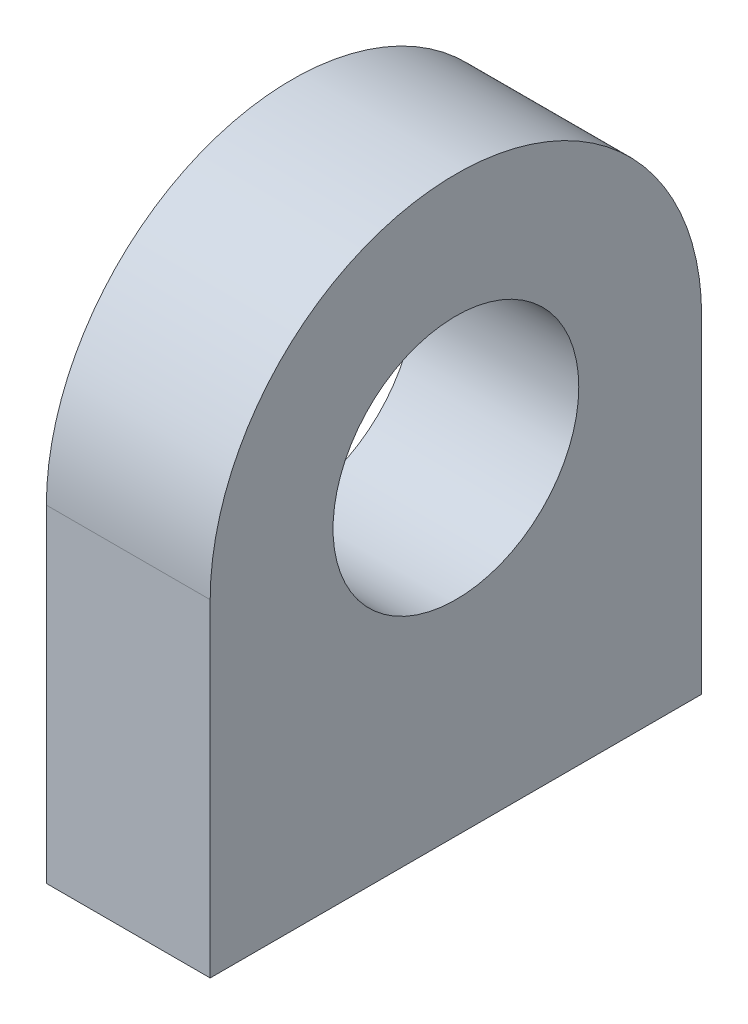
ISO-10303-21;
HEADER;
FILE_DESCRIPTION(('STEP AP214'),'2;1');
FILE_NAME('part.step','',(''),(''),'','','');
FILE_SCHEMA(('AUTOMOTIVE_DESIGN { 1 0 10303 214 1 1 1 1 }'));
ENDSEC;
DATA;
#1=APPLICATION_CONTEXT('core data for automotive mechanical design processes');
#2=APPLICATION_PROTOCOL_DEFINITION('international standard','automotive_design',2000,#1);
#3=PRODUCT_CONTEXT('',#1,'mechanical');
#4=PRODUCT('Part','Part','',(#3));
#5=PRODUCT_RELATED_PRODUCT_CATEGORY('part','',(#4));
#6=PRODUCT_DEFINITION_FORMATION('','',#4);
#7=PRODUCT_DEFINITION_CONTEXT('part definition',#1,'design');
#8=PRODUCT_DEFINITION('design','',#6,#7);
#9=PRODUCT_DEFINITION_SHAPE('','',#8);
#10=(LENGTH_UNIT() NAMED_UNIT(*) SI_UNIT(.MILLI.,.METRE.));
#11=(NAMED_UNIT(*) PLANE_ANGLE_UNIT() SI_UNIT($,.RADIAN.));
#12=(NAMED_UNIT(*) SI_UNIT($,.STERADIAN.) SOLID_ANGLE_UNIT());
#13=UNCERTAINTY_MEASURE_WITH_UNIT(LENGTH_MEASURE(1.E-05),#10,'distance_accuracy_value','');
#14=(GEOMETRIC_REPRESENTATION_CONTEXT(3) GLOBAL_UNCERTAINTY_ASSIGNED_CONTEXT((#13)) GLOBAL_UNIT_ASSIGNED_CONTEXT((#10,
#11,#12)) REPRESENTATION_CONTEXT('',''));
#15=CARTESIAN_POINT('',(0.,0.,0.));
#16=DIRECTION('',(0.,0.,1.));
#17=DIRECTION('',(1.,0.,0.));
#18=AXIS2_PLACEMENT_3D('',#15,#16,#17);
#19=CARTESIAN_POINT('',(10.,0.,0.));
#20=DIRECTION('',(1.,0.,0.));
#21=DIRECTION('',(0.,0.,-1.));
#22=AXIS2_PLACEMENT_3D('',#19,#20,#21);
#23=PLANE('',#22);
#24=CARTESIAN_POINT('',(10.,0.,0.));
#25=DIRECTION('',(1.,0.,0.));
#26=DIRECTION('',(0.,0.,-1.));
#27=AXIS2_PLACEMENT_3D('',#24,#25,#26);
#28=CIRCLE('',#27,15.);
#29=CARTESIAN_POINT('',(10.,0.,-15.));
#30=VERTEX_POINT('',#29);
#31=CARTESIAN_POINT('',(10.,0.,15.));
#32=VERTEX_POINT('',#31);
#33=EDGE_CURVE('E85',#30,#32,#28,.T.);
#34=ORIENTED_EDGE('',*,*,#33,.T.);
#35=DIRECTION('',(0.,-1.,0.));
#36=VECTOR('',#35,1.);
#37=CARTESIAN_POINT('',(10.,0.,15.));
#38=LINE('',#37,#36);
#39=CARTESIAN_POINT('',(10.,-20.,15.));
#40=VERTEX_POINT('',#39);
#41=EDGE_CURVE('E80',#32,#40,#38,.T.);
#42=ORIENTED_EDGE('',*,*,#41,.T.);
#43=DIRECTION('',(0.,0.,-1.));
#44=VECTOR('',#43,1.);
#45=CARTESIAN_POINT('',(10.,-20.,15.));
#46=LINE('',#45,#44);
#47=CARTESIAN_POINT('',(10.,-20.,-15.));
#48=VERTEX_POINT('',#47);
#49=EDGE_CURVE('E83',#40,#48,#46,.T.);
#50=ORIENTED_EDGE('',*,*,#49,.T.);
#51=DIRECTION('',(0.,1.,0.));
#52=VECTOR('',#51,1.);
#53=CARTESIAN_POINT('',(10.,0.,-15.));
#54=LINE('',#53,#52);
#55=EDGE_CURVE('E50',#48,#30,#54,.T.);
#56=ORIENTED_EDGE('',*,*,#55,.T.);
#57=EDGE_LOOP('',(#34,#42,#50,#56));
#58=FACE_BOUND('',#57,.T.);
#59=CARTESIAN_POINT('',(10.,0.,0.));
#60=DIRECTION('',(1.,0.,0.));
#61=DIRECTION('',(0.,0.,-1.));
#62=AXIS2_PLACEMENT_3D('',#59,#60,#61);
#63=CIRCLE('',#62,7.5);
#64=CARTESIAN_POINT('',(10.,0.,-7.5));
#65=VERTEX_POINT('',#64);
#66=EDGE_CURVE('E100',#65,#65,#63,.T.);
#67=ORIENTED_EDGE('',*,*,#66,.F.);
#68=EDGE_LOOP('',(#67));
#69=FACE_BOUND('',#68,.T.);
#70=ADVANCED_FACE('F33',(#58,#69),#23,.T.);
#71=CARTESIAN_POINT('',(0.,0.,0.));
#72=DIRECTION('',(1.,0.,0.));
#73=DIRECTION('',(0.,0.,-1.));
#74=AXIS2_PLACEMENT_3D('',#71,#72,#73);
#75=PLANE('',#74);
#76=CARTESIAN_POINT('',(0.,0.,0.));
#77=DIRECTION('',(1.,0.,0.));
#78=DIRECTION('',(0.,0.,-1.));
#79=AXIS2_PLACEMENT_3D('',#76,#77,#78);
#80=CIRCLE('',#79,15.);
#81=CARTESIAN_POINT('',(0.,0.,-15.));
#82=VERTEX_POINT('',#81);
#83=CARTESIAN_POINT('',(0.,0.,15.));
#84=VERTEX_POINT('',#83);
#85=EDGE_CURVE('E97',#82,#84,#80,.T.);
#86=ORIENTED_EDGE('',*,*,#85,.F.);
#87=DIRECTION('',(0.,1.,0.));
#88=VECTOR('',#87,1.);
#89=CARTESIAN_POINT('',(0.,0.,-15.));
#90=LINE('',#89,#88);
#91=CARTESIAN_POINT('',(0.,-20.,-15.));
#92=VERTEX_POINT('',#91);
#93=EDGE_CURVE('E73',#92,#82,#90,.T.);
#94=ORIENTED_EDGE('',*,*,#93,.F.);
#95=DIRECTION('',(0.,0.,-1.));
#96=VECTOR('',#95,1.);
#97=CARTESIAN_POINT('',(0.,-20.,15.));
#98=LINE('',#97,#96);
#99=CARTESIAN_POINT('',(0.,-20.,15.));
#100=VERTEX_POINT('',#99);
#101=EDGE_CURVE('E67',#100,#92,#98,.T.);
#102=ORIENTED_EDGE('',*,*,#101,.F.);
#103=DIRECTION('',(0.,-1.,0.));
#104=VECTOR('',#103,1.);
#105=CARTESIAN_POINT('',(0.,0.,15.));
#106=LINE('',#105,#104);
#107=EDGE_CURVE('E89',#84,#100,#106,.T.);
#108=ORIENTED_EDGE('',*,*,#107,.F.);
#109=EDGE_LOOP('',(#86,#94,#102,#108));
#110=FACE_BOUND('',#109,.T.);
#111=CARTESIAN_POINT('',(0.,0.,0.));
#112=DIRECTION('',(1.,0.,0.));
#113=DIRECTION('',(0.,0.,-1.));
#114=AXIS2_PLACEMENT_3D('',#111,#112,#113);
#115=CIRCLE('',#114,7.5);
#116=CARTESIAN_POINT('',(0.,0.,-7.5));
#117=VERTEX_POINT('',#116);
#118=EDGE_CURVE('E112',#117,#117,#115,.T.);
#119=ORIENTED_EDGE('',*,*,#118,.T.);
#120=EDGE_LOOP('',(#119));
#121=FACE_BOUND('',#120,.T.);
#122=ADVANCED_FACE('F108',(#110,#121),#75,.F.);
#123=CARTESIAN_POINT('',(10.,0.,0.));
#124=DIRECTION('',(-1.,0.,0.));
#125=DIRECTION('',(0.,0.,1.));
#126=AXIS2_PLACEMENT_3D('',#123,#124,#125);
#127=CYLINDRICAL_SURFACE('',#126,15.);
#128=ORIENTED_EDGE('',*,*,#85,.T.);
#129=DIRECTION('',(-1.,0.,0.));
#130=VECTOR('',#129,1.);
#131=CARTESIAN_POINT('',(10.,0.,15.));
#132=LINE('',#131,#130);
#133=EDGE_CURVE('E11',#32,#84,#132,.T.);
#134=ORIENTED_EDGE('',*,*,#133,.F.);
#135=ORIENTED_EDGE('',*,*,#33,.F.);
#136=DIRECTION('',(-1.,0.,0.));
#137=VECTOR('',#136,1.);
#138=CARTESIAN_POINT('',(10.,0.,-15.));
#139=LINE('',#138,#137);
#140=EDGE_CURVE('E93',#30,#82,#139,.T.);
#141=ORIENTED_EDGE('',*,*,#140,.T.);
#142=EDGE_LOOP('',(#128,#134,#135,#141));
#143=FACE_BOUND('',#142,.T.);
#144=ADVANCED_FACE('F35',(#143),#127,.T.);
#145=CARTESIAN_POINT('',(10.,0.,15.));
#146=DIRECTION('',(0.,0.,-1.));
#147=DIRECTION('',(-1.,0.,0.));
#148=AXIS2_PLACEMENT_3D('',#145,#146,#147);
#149=PLANE('',#148);
#150=ORIENTED_EDGE('',*,*,#107,.T.);
#151=DIRECTION('',(-1.,0.,0.));
#152=VECTOR('',#151,1.);
#153=CARTESIAN_POINT('',(10.,-20.,15.));
#154=LINE('',#153,#152);
#155=EDGE_CURVE('E42',#40,#100,#154,.T.);
#156=ORIENTED_EDGE('',*,*,#155,.F.);
#157=ORIENTED_EDGE('',*,*,#41,.F.);
#158=ORIENTED_EDGE('',*,*,#133,.T.);
#159=EDGE_LOOP('',(#150,#156,#157,#158));
#160=FACE_BOUND('',#159,.T.);
#161=ADVANCED_FACE('F88',(#160),#149,.F.);
#162=CARTESIAN_POINT('',(10.,-20.,15.));
#163=DIRECTION('',(0.,1.,0.));
#164=DIRECTION('',(0.,0.,1.));
#165=AXIS2_PLACEMENT_3D('',#162,#163,#164);
#166=PLANE('',#165);
#167=ORIENTED_EDGE('',*,*,#101,.T.);
#168=DIRECTION('',(-1.,0.,0.));
#169=VECTOR('',#168,1.);
#170=CARTESIAN_POINT('',(10.,-20.,-15.));
#171=LINE('',#170,#169);
#172=EDGE_CURVE('E90',#48,#92,#171,.T.);
#173=ORIENTED_EDGE('',*,*,#172,.F.);
#174=ORIENTED_EDGE('',*,*,#49,.F.);
#175=ORIENTED_EDGE('',*,*,#155,.T.);
#176=EDGE_LOOP('',(#167,#173,#174,#175));
#177=FACE_BOUND('',#176,.T.);
#178=ADVANCED_FACE('F91',(#177),#166,.F.);
#179=CARTESIAN_POINT('',(10.,0.,-15.));
#180=DIRECTION('',(0.,0.,1.));
#181=DIRECTION('',(0.,-1.,0.));
#182=AXIS2_PLACEMENT_3D('',#179,#180,#181);
#183=PLANE('',#182);
#184=ORIENTED_EDGE('',*,*,#93,.T.);
#185=ORIENTED_EDGE('',*,*,#140,.F.);
#186=ORIENTED_EDGE('',*,*,#55,.F.);
#187=ORIENTED_EDGE('',*,*,#172,.T.);
#188=EDGE_LOOP('',(#184,#185,#186,#187));
#189=FACE_BOUND('',#188,.T.);
#190=ADVANCED_FACE('F105',(#189),#183,.F.);
#191=CARTESIAN_POINT('',(10.,0.,0.));
#192=DIRECTION('',(-1.,0.,0.));
#193=DIRECTION('',(0.,0.,1.));
#194=AXIS2_PLACEMENT_3D('',#191,#192,#193);
#195=CYLINDRICAL_SURFACE('',#194,7.5);
#196=ORIENTED_EDGE('',*,*,#66,.T.);
#197=EDGE_LOOP('',(#196));
#198=FACE_BOUND('',#197,.T.);
#199=ORIENTED_EDGE('',*,*,#118,.F.);
#200=EDGE_LOOP('',(#199));
#201=FACE_BOUND('',#200,.T.);
#202=ADVANCED_FACE('F118',(#198,#201),#195,.F.);
#203=CLOSED_SHELL('',(#70,#122,#144,#161,#178,#190,#202));
#204=MANIFOLD_SOLID_BREP('B2',#203);
#205=ADVANCED_BREP_SHAPE_REPRESENTATION('',(#18,#204),#14);
#206=SHAPE_DEFINITION_REPRESENTATION(#9,#205);
ENDSEC;
END-ISO-10303-21;
